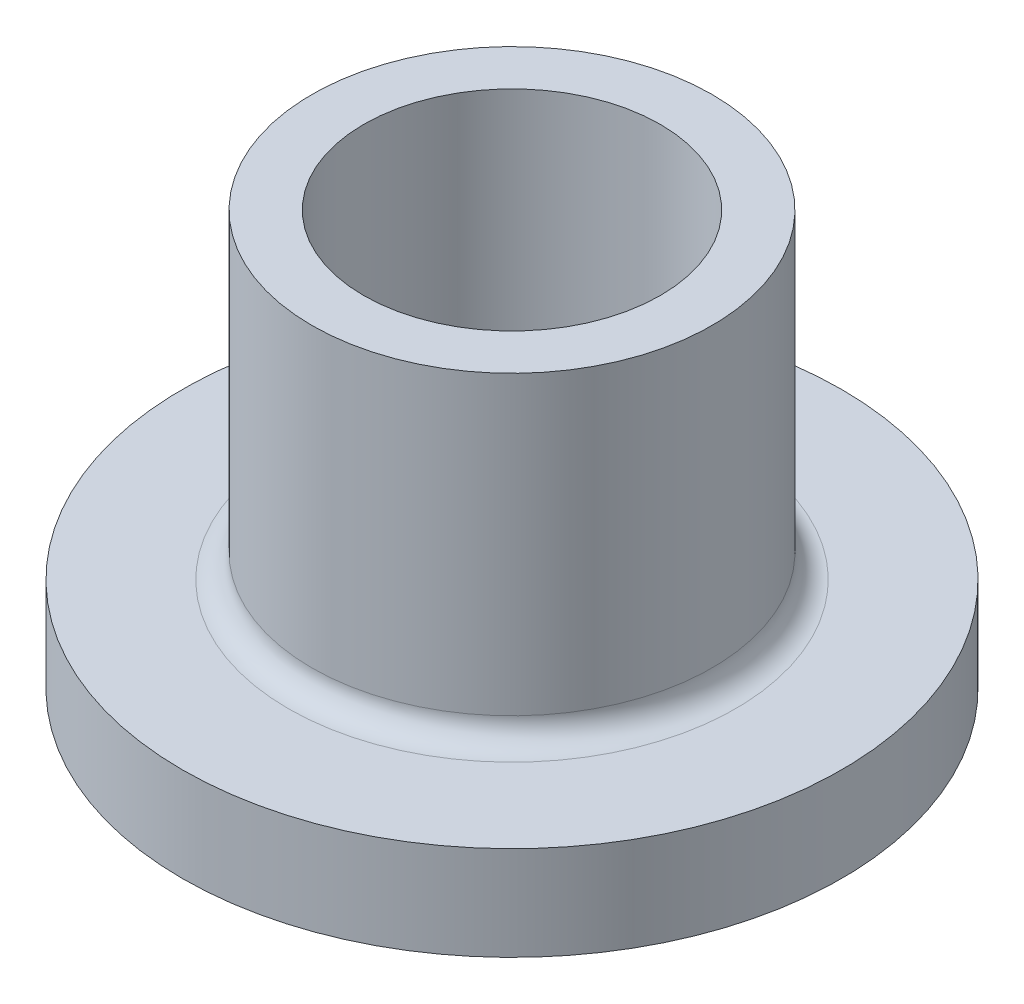
ISO-10303-21;
HEADER;
FILE_DESCRIPTION(('STEP AP214'),'2;1');
FILE_NAME('part.step','',(''),(''),'','','');
FILE_SCHEMA(('AUTOMOTIVE_DESIGN { 1 0 10303 214 1 1 1 1 }'));
ENDSEC;
DATA;
#1=APPLICATION_CONTEXT('core data for automotive mechanical design processes');
#2=APPLICATION_PROTOCOL_DEFINITION('international standard','automotive_design',2000,#1);
#3=PRODUCT_CONTEXT('',#1,'mechanical');
#4=PRODUCT('Part','Part','',(#3));
#5=PRODUCT_RELATED_PRODUCT_CATEGORY('part','',(#4));
#6=PRODUCT_DEFINITION_FORMATION('','',#4);
#7=PRODUCT_DEFINITION_CONTEXT('part definition',#1,'design');
#8=PRODUCT_DEFINITION('design','',#6,#7);
#9=PRODUCT_DEFINITION_SHAPE('','',#8);
#10=(LENGTH_UNIT() NAMED_UNIT(*) SI_UNIT(.MILLI.,.METRE.));
#11=(NAMED_UNIT(*) PLANE_ANGLE_UNIT() SI_UNIT($,.RADIAN.));
#12=(NAMED_UNIT(*) SI_UNIT($,.STERADIAN.) SOLID_ANGLE_UNIT());
#13=UNCERTAINTY_MEASURE_WITH_UNIT(LENGTH_MEASURE(1.E-05),#10,'distance_accuracy_value','');
#14=(GEOMETRIC_REPRESENTATION_CONTEXT(3) GLOBAL_UNCERTAINTY_ASSIGNED_CONTEXT((#13)) GLOBAL_UNIT_ASSIGNED_CONTEXT((#10,
#11,#12)) REPRESENTATION_CONTEXT('',''));
#15=CARTESIAN_POINT('',(0.,0.,0.));
#16=DIRECTION('',(0.,0.,1.));
#17=DIRECTION('',(1.,0.,0.));
#18=AXIS2_PLACEMENT_3D('',#15,#16,#17);
#19=CARTESIAN_POINT('',(0.,2.,0.));
#20=DIRECTION('',(0.,-1.,0.));
#21=DIRECTION('',(0.,0.,-1.));
#22=AXIS2_PLACEMENT_3D('',#19,#20,#21);
#23=CYLINDRICAL_SURFACE('',#22,7.);
#24=CARTESIAN_POINT('',(0.,2.,0.));
#25=DIRECTION('',(0.,1.,0.));
#26=DIRECTION('',(0.,0.,1.));
#27=AXIS2_PLACEMENT_3D('',#24,#25,#26);
#28=CIRCLE('',#27,7.);
#29=CARTESIAN_POINT('',(0.,2.,7.));
#30=VERTEX_POINT('',#29);
#31=EDGE_CURVE('E44',#30,#30,#28,.T.);
#32=ORIENTED_EDGE('',*,*,#31,.F.);
#33=EDGE_LOOP('',(#32));
#34=FACE_BOUND('',#33,.T.);
#35=CARTESIAN_POINT('',(0.,0.,0.));
#36=DIRECTION('',(0.,1.,0.));
#37=DIRECTION('',(0.,0.,1.));
#38=AXIS2_PLACEMENT_3D('',#35,#36,#37);
#39=CIRCLE('',#38,7.);
#40=CARTESIAN_POINT('',(0.,0.,7.));
#41=VERTEX_POINT('',#40);
#42=EDGE_CURVE('E48',#41,#41,#39,.T.);
#43=ORIENTED_EDGE('',*,*,#42,.T.);
#44=EDGE_LOOP('',(#43));
#45=FACE_BOUND('',#44,.T.);
#46=ADVANCED_FACE('F33',(#34,#45),#23,.T.);
#47=CARTESIAN_POINT('',(0.,2.,0.));
#48=DIRECTION('',(0.,1.,0.));
#49=DIRECTION('',(0.,0.,1.));
#50=AXIS2_PLACEMENT_3D('',#47,#48,#49);
#51=PLANE('',#50);
#52=CARTESIAN_POINT('',(0.,2.,0.));
#53=DIRECTION('',(0.,1.,0.));
#54=DIRECTION('',(0.,0.,1.));
#55=AXIS2_PLACEMENT_3D('',#52,#53,#54);
#56=CIRCLE('',#55,4.75);
#57=CARTESIAN_POINT('',(0.,2.,4.75));
#58=VERTEX_POINT('',#57);
#59=EDGE_CURVE('E10',#58,#58,#56,.F.);
#60=ORIENTED_EDGE('',*,*,#59,.T.);
#61=EDGE_LOOP('',(#60));
#62=FACE_BOUND('',#61,.T.);
#63=ORIENTED_EDGE('',*,*,#31,.T.);
#64=EDGE_LOOP('',(#63));
#65=FACE_BOUND('',#64,.T.);
#66=ADVANCED_FACE('F79',(#62,#65),#51,.T.);
#67=CARTESIAN_POINT('',(0.,0.,0.));
#68=DIRECTION('',(0.,1.,0.));
#69=DIRECTION('',(0.,0.,1.));
#70=AXIS2_PLACEMENT_3D('',#67,#68,#69);
#71=PLANE('',#70);
#72=CARTESIAN_POINT('',(0.,0.,0.));
#73=DIRECTION('',(0.,1.,0.));
#74=DIRECTION('',(0.,0.,1.));
#75=AXIS2_PLACEMENT_3D('',#72,#73,#74);
#76=CIRCLE('',#75,3.15);
#77=CARTESIAN_POINT('',(0.,0.,3.15));
#78=VERTEX_POINT('',#77);
#79=EDGE_CURVE('E56',#78,#78,#76,.F.);
#80=ORIENTED_EDGE('',*,*,#79,.F.);
#81=EDGE_LOOP('',(#80));
#82=FACE_BOUND('',#81,.T.);
#83=ORIENTED_EDGE('',*,*,#42,.F.);
#84=EDGE_LOOP('',(#83));
#85=FACE_BOUND('',#84,.T.);
#86=ADVANCED_FACE('F74',(#82,#85),#71,.F.);
#87=CARTESIAN_POINT('',(0.,8.8,0.));
#88=DIRECTION('',(0.,-1.,0.));
#89=DIRECTION('',(0.,0.,-1.));
#90=AXIS2_PLACEMENT_3D('',#87,#88,#89);
#91=CYLINDRICAL_SURFACE('',#90,4.25);
#92=CARTESIAN_POINT('',(0.,2.5,0.));
#93=DIRECTION('',(0.,1.,0.));
#94=DIRECTION('',(0.,0.,1.));
#95=AXIS2_PLACEMENT_3D('',#92,#93,#94);
#96=CIRCLE('',#95,4.25);
#97=CARTESIAN_POINT('',(0.,2.5,4.25));
#98=VERTEX_POINT('',#97);
#99=EDGE_CURVE('E40',#98,#98,#96,.T.);
#100=ORIENTED_EDGE('',*,*,#99,.T.);
#101=EDGE_LOOP('',(#100));
#102=FACE_BOUND('',#101,.T.);
#103=CARTESIAN_POINT('',(0.,8.8,0.));
#104=DIRECTION('',(0.,1.,0.));
#105=DIRECTION('',(0.,0.,1.));
#106=AXIS2_PLACEMENT_3D('',#103,#104,#105);
#107=CIRCLE('',#106,4.25);
#108=CARTESIAN_POINT('',(0.,8.8,4.25));
#109=VERTEX_POINT('',#108);
#110=EDGE_CURVE('E52',#109,#109,#107,.T.);
#111=ORIENTED_EDGE('',*,*,#110,.F.);
#112=EDGE_LOOP('',(#111));
#113=FACE_BOUND('',#112,.T.);
#114=ADVANCED_FACE('F69',(#102,#113),#91,.T.);
#115=CARTESIAN_POINT('',(0.,8.8,0.));
#116=DIRECTION('',(0.,1.,0.));
#117=DIRECTION('',(0.,0.,1.));
#118=AXIS2_PLACEMENT_3D('',#115,#116,#117);
#119=PLANE('',#118);
#120=CARTESIAN_POINT('',(0.,8.8,0.));
#121=DIRECTION('',(0.,1.,0.));
#122=DIRECTION('',(0.,0.,1.));
#123=AXIS2_PLACEMENT_3D('',#120,#121,#122);
#124=CIRCLE('',#123,3.15);
#125=CARTESIAN_POINT('',(0.,8.8,3.15));
#126=VERTEX_POINT('',#125);
#127=EDGE_CURVE('E59',#126,#126,#124,.T.);
#128=ORIENTED_EDGE('',*,*,#127,.F.);
#129=EDGE_LOOP('',(#128));
#130=FACE_BOUND('',#129,.T.);
#131=ORIENTED_EDGE('',*,*,#110,.T.);
#132=EDGE_LOOP('',(#131));
#133=FACE_BOUND('',#132,.T.);
#134=ADVANCED_FACE('F66',(#130,#133),#119,.T.);
#135=CARTESIAN_POINT('',(0.,-0.000999999999999265,0.));
#136=DIRECTION('',(0.,1.,0.));
#137=DIRECTION('',(0.,0.,1.));
#138=AXIS2_PLACEMENT_3D('',#135,#136,#137);
#139=CYLINDRICAL_SURFACE('',#138,3.15);
#140=ORIENTED_EDGE('',*,*,#127,.T.);
#141=EDGE_LOOP('',(#140));
#142=FACE_BOUND('',#141,.T.);
#143=ORIENTED_EDGE('',*,*,#79,.T.);
#144=EDGE_LOOP('',(#143));
#145=FACE_BOUND('',#144,.T.);
#146=ADVANCED_FACE('F63',(#142,#145),#139,.F.);
#147=CARTESIAN_POINT('',(0.,2.5,0.));
#148=DIRECTION('',(0.,1.,0.));
#149=DIRECTION('',(0.,0.,1.));
#150=AXIS2_PLACEMENT_3D('',#147,#148,#149);
#151=TOROIDAL_SURFACE('',#150,4.75,0.5);
#152=ORIENTED_EDGE('',*,*,#59,.F.);
#153=EDGE_LOOP('',(#152));
#154=FACE_BOUND('',#153,.T.);
#155=ORIENTED_EDGE('',*,*,#99,.F.);
#156=EDGE_LOOP('',(#155));
#157=FACE_BOUND('',#156,.T.);
#158=ADVANCED_FACE('F35',(#154,#157),#151,.F.);
#159=CLOSED_SHELL('',(#46,#66,#86,#114,#134,#146,#158));
#160=MANIFOLD_SOLID_BREP('B2',#159);
#161=ADVANCED_BREP_SHAPE_REPRESENTATION('',(#18,#160),#14);
#162=SHAPE_DEFINITION_REPRESENTATION(#9,#161);
ENDSEC;
END-ISO-10303-21;
